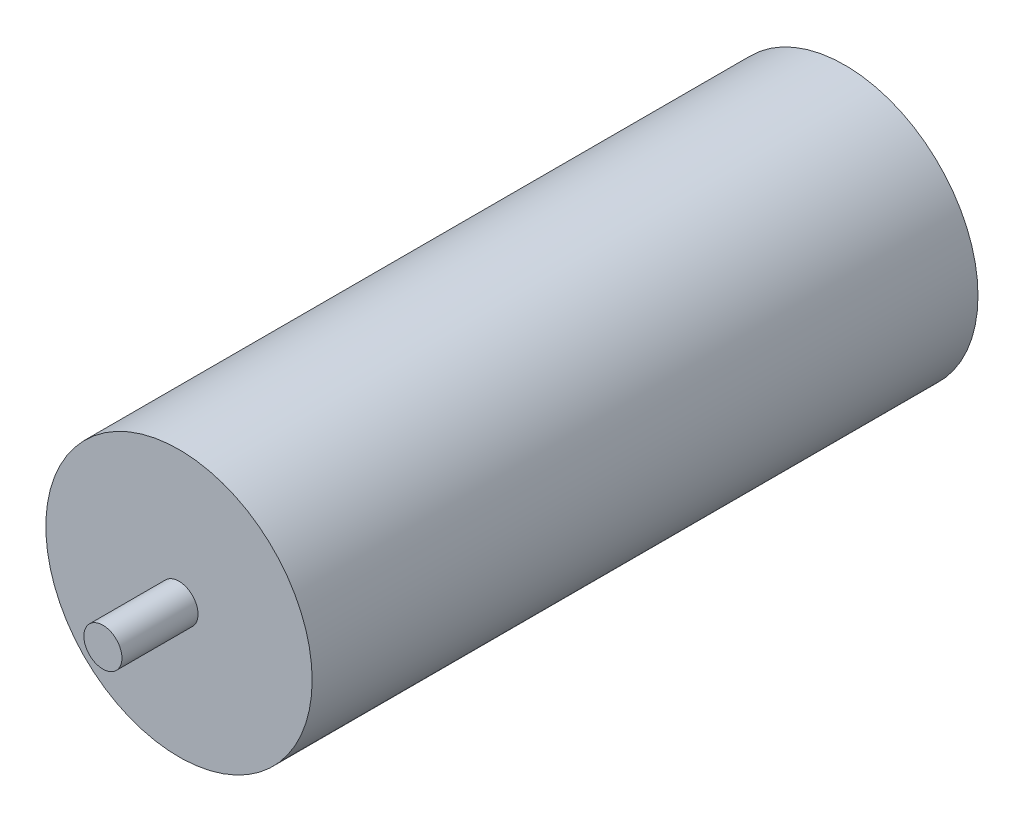
ISO-10303-21;
HEADER;
FILE_DESCRIPTION(('STEP AP214'),'2;1');
FILE_NAME('part.step','',(''),(''),'','','');
FILE_SCHEMA(('AUTOMOTIVE_DESIGN { 1 0 10303 214 1 1 1 1 }'));
ENDSEC;
DATA;
#1=APPLICATION_CONTEXT('core data for automotive mechanical design processes');
#2=APPLICATION_PROTOCOL_DEFINITION('international standard','automotive_design',2000,#1);
#3=PRODUCT_CONTEXT('',#1,'mechanical');
#4=PRODUCT('Part','Part','',(#3));
#5=PRODUCT_RELATED_PRODUCT_CATEGORY('part','',(#4));
#6=PRODUCT_DEFINITION_FORMATION('','',#4);
#7=PRODUCT_DEFINITION_CONTEXT('part definition',#1,'design');
#8=PRODUCT_DEFINITION('design','',#6,#7);
#9=PRODUCT_DEFINITION_SHAPE('','',#8);
#10=(LENGTH_UNIT() NAMED_UNIT(*) SI_UNIT(.MILLI.,.METRE.));
#11=(NAMED_UNIT(*) PLANE_ANGLE_UNIT() SI_UNIT($,.RADIAN.));
#12=(NAMED_UNIT(*) SI_UNIT($,.STERADIAN.) SOLID_ANGLE_UNIT());
#13=UNCERTAINTY_MEASURE_WITH_UNIT(LENGTH_MEASURE(1.E-05),#10,'distance_accuracy_value','');
#14=(GEOMETRIC_REPRESENTATION_CONTEXT(3) GLOBAL_UNCERTAINTY_ASSIGNED_CONTEXT((#13)) GLOBAL_UNIT_ASSIGNED_CONTEXT((#10,
#11,#12)) REPRESENTATION_CONTEXT('',''));
#15=CARTESIAN_POINT('',(0.,0.,0.));
#16=DIRECTION('',(0.,0.,1.));
#17=DIRECTION('',(1.,0.,0.));
#18=AXIS2_PLACEMENT_3D('',#15,#16,#17);
#19=CARTESIAN_POINT('',(0.,0.,87.5));
#20=DIRECTION('',(0.,0.,-1.));
#21=DIRECTION('',(-1.,0.,0.));
#22=AXIS2_PLACEMENT_3D('',#19,#20,#21);
#23=CYLINDRICAL_SURFACE('',#22,35.);
#24=CARTESIAN_POINT('',(0.,0.,87.5));
#25=DIRECTION('',(0.,0.,1.));
#26=DIRECTION('',(1.,0.,0.));
#27=AXIS2_PLACEMENT_3D('',#24,#25,#26);
#28=CIRCLE('',#27,35.);
#29=CARTESIAN_POINT('',(35.,0.,87.5));
#30=VERTEX_POINT('',#29);
#31=EDGE_CURVE('E10',#30,#30,#28,.T.);
#32=ORIENTED_EDGE('',*,*,#31,.F.);
#33=EDGE_LOOP('',(#32));
#34=FACE_BOUND('',#33,.T.);
#35=CARTESIAN_POINT('',(0.,0.,-87.5));
#36=DIRECTION('',(0.,0.,1.));
#37=DIRECTION('',(1.,0.,0.));
#38=AXIS2_PLACEMENT_3D('',#35,#36,#37);
#39=CIRCLE('',#38,35.);
#40=CARTESIAN_POINT('',(35.,0.,-87.5));
#41=VERTEX_POINT('',#40);
#42=EDGE_CURVE('E40',#41,#41,#39,.T.);
#43=ORIENTED_EDGE('',*,*,#42,.T.);
#44=EDGE_LOOP('',(#43));
#45=FACE_BOUND('',#44,.T.);
#46=ADVANCED_FACE('F37',(#34,#45),#23,.T.);
#47=CARTESIAN_POINT('',(0.,0.,87.5));
#48=DIRECTION('',(0.,0.,1.));
#49=DIRECTION('',(1.,0.,0.));
#50=AXIS2_PLACEMENT_3D('',#47,#48,#49);
#51=PLANE('',#50);
#52=CARTESIAN_POINT('',(0.,0.,87.5));
#53=DIRECTION('',(0.,0.,1.));
#54=DIRECTION('',(1.,0.,0.));
#55=AXIS2_PLACEMENT_3D('',#52,#53,#54);
#56=CIRCLE('',#55,5.);
#57=CARTESIAN_POINT('',(5.,0.,87.5));
#58=VERTEX_POINT('',#57);
#59=EDGE_CURVE('E51',#58,#58,#56,.T.);
#60=ORIENTED_EDGE('',*,*,#59,.F.);
#61=EDGE_LOOP('',(#60));
#62=FACE_BOUND('',#61,.T.);
#63=ORIENTED_EDGE('',*,*,#31,.T.);
#64=EDGE_LOOP('',(#63));
#65=FACE_BOUND('',#64,.T.);
#66=ADVANCED_FACE('F79',(#62,#65),#51,.T.);
#67=CARTESIAN_POINT('',(0.,0.,-87.5));
#68=DIRECTION('',(0.,0.,1.));
#69=DIRECTION('',(1.,0.,0.));
#70=AXIS2_PLACEMENT_3D('',#67,#68,#69);
#71=PLANE('',#70);
#72=CARTESIAN_POINT('',(0.,0.,-87.5));
#73=DIRECTION('',(0.,0.,1.));
#74=DIRECTION('',(1.,0.,0.));
#75=AXIS2_PLACEMENT_3D('',#72,#73,#74);
#76=CIRCLE('',#75,5.);
#77=CARTESIAN_POINT('',(5.,0.,-87.5));
#78=VERTEX_POINT('',#77);
#79=EDGE_CURVE('E59',#78,#78,#76,.T.);
#80=ORIENTED_EDGE('',*,*,#79,.T.);
#81=EDGE_LOOP('',(#80));
#82=FACE_BOUND('',#81,.T.);
#83=ORIENTED_EDGE('',*,*,#42,.F.);
#84=EDGE_LOOP('',(#83));
#85=FACE_BOUND('',#84,.T.);
#86=ADVANCED_FACE('F84',(#82,#85),#71,.F.);
#87=CARTESIAN_POINT('',(0.,0.,107.5));
#88=DIRECTION('',(0.,0.,-1.));
#89=DIRECTION('',(-1.,0.,0.));
#90=AXIS2_PLACEMENT_3D('',#87,#88,#89);
#91=CYLINDRICAL_SURFACE('',#90,5.);
#92=CARTESIAN_POINT('',(0.,0.,107.5));
#93=DIRECTION('',(0.,0.,1.));
#94=DIRECTION('',(1.,0.,0.));
#95=AXIS2_PLACEMENT_3D('',#92,#93,#94);
#96=CIRCLE('',#95,5.);
#97=CARTESIAN_POINT('',(5.,0.,107.5));
#98=VERTEX_POINT('',#97);
#99=EDGE_CURVE('E49',#98,#98,#96,.T.);
#100=ORIENTED_EDGE('',*,*,#99,.F.);
#101=EDGE_LOOP('',(#100));
#102=FACE_BOUND('',#101,.T.);
#103=ORIENTED_EDGE('',*,*,#59,.T.);
#104=EDGE_LOOP('',(#103));
#105=FACE_BOUND('',#104,.T.);
#106=ADVANCED_FACE('F91',(#102,#105),#91,.T.);
#107=CARTESIAN_POINT('',(0.,0.,107.5));
#108=DIRECTION('',(0.,0.,1.));
#109=DIRECTION('',(1.,0.,0.));
#110=AXIS2_PLACEMENT_3D('',#107,#108,#109);
#111=PLANE('',#110);
#112=ORIENTED_EDGE('',*,*,#99,.T.);
#113=EDGE_LOOP('',(#112));
#114=FACE_BOUND('',#113,.T.);
#115=ADVANCED_FACE('F76',(#114),#111,.T.);
#116=CARTESIAN_POINT('',(0.,0.,-107.5));
#117=DIRECTION('',(0.,0.,1.));
#118=DIRECTION('',(1.,0.,0.));
#119=AXIS2_PLACEMENT_3D('',#116,#117,#118);
#120=CYLINDRICAL_SURFACE('',#119,5.);
#121=CARTESIAN_POINT('',(0.,0.,-107.5));
#122=DIRECTION('',(0.,0.,1.));
#123=DIRECTION('',(1.,0.,0.));
#124=AXIS2_PLACEMENT_3D('',#121,#122,#123);
#125=CIRCLE('',#124,5.);
#126=CARTESIAN_POINT('',(5.,0.,-107.5));
#127=VERTEX_POINT('',#126);
#128=EDGE_CURVE('E55',#127,#127,#125,.T.);
#129=ORIENTED_EDGE('',*,*,#128,.T.);
#130=EDGE_LOOP('',(#129));
#131=FACE_BOUND('',#130,.T.);
#132=ORIENTED_EDGE('',*,*,#79,.F.);
#133=EDGE_LOOP('',(#132));
#134=FACE_BOUND('',#133,.T.);
#135=ADVANCED_FACE('F67',(#131,#134),#120,.T.);
#136=CARTESIAN_POINT('',(0.,0.,-107.5));
#137=DIRECTION('',(0.,0.,-1.));
#138=DIRECTION('',(1.,0.,0.));
#139=AXIS2_PLACEMENT_3D('',#136,#137,#138);
#140=PLANE('',#139);
#141=ORIENTED_EDGE('',*,*,#128,.F.);
#142=EDGE_LOOP('',(#141));
#143=FACE_BOUND('',#142,.T.);
#144=ADVANCED_FACE('F70',(#143),#140,.T.);
#145=CLOSED_SHELL('',(#46,#66,#86,#106,#115,#135,#144));
#146=MANIFOLD_SOLID_BREP('B2',#145);
#147=ADVANCED_BREP_SHAPE_REPRESENTATION('',(#18,#146),#14);
#148=SHAPE_DEFINITION_REPRESENTATION(#9,#147);
ENDSEC;
END-ISO-10303-21;
